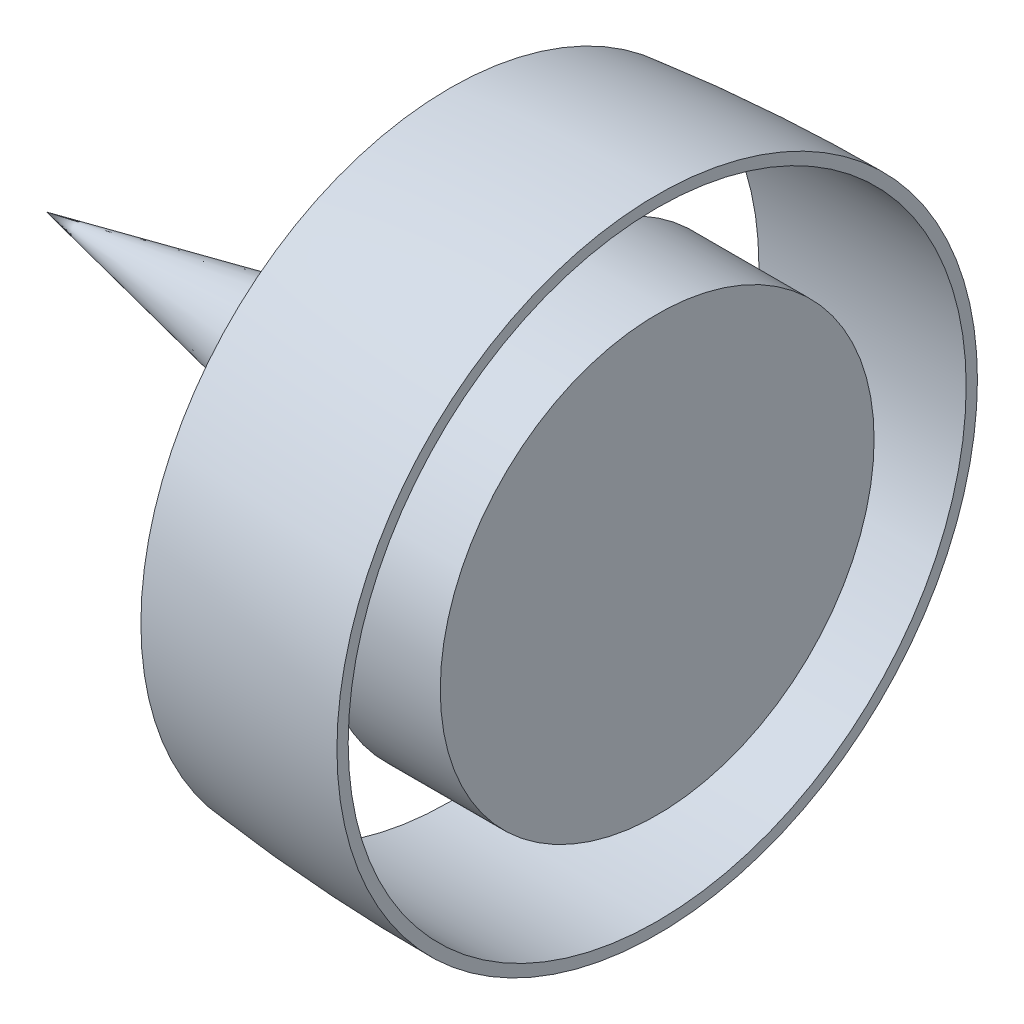
ISO-10303-21;
HEADER;
FILE_DESCRIPTION(('STEP AP214'),'2;1');
FILE_NAME('part.step','',(''),(''),'','','');
FILE_SCHEMA(('AUTOMOTIVE_DESIGN { 1 0 10303 214 1 1 1 1 }'));
ENDSEC;
DATA;
#1=APPLICATION_CONTEXT('core data for automotive mechanical design processes');
#2=APPLICATION_PROTOCOL_DEFINITION('international standard','automotive_design',2000,#1);
#3=PRODUCT_CONTEXT('',#1,'mechanical');
#4=PRODUCT('Part','Part','',(#3));
#5=PRODUCT_RELATED_PRODUCT_CATEGORY('part','',(#4));
#6=PRODUCT_DEFINITION_FORMATION('','',#4);
#7=PRODUCT_DEFINITION_CONTEXT('part definition',#1,'design');
#8=PRODUCT_DEFINITION('design','',#6,#7);
#9=PRODUCT_DEFINITION_SHAPE('','',#8);
#10=(LENGTH_UNIT() NAMED_UNIT(*) SI_UNIT(.MILLI.,.METRE.));
#11=(NAMED_UNIT(*) PLANE_ANGLE_UNIT() SI_UNIT($,.RADIAN.));
#12=(NAMED_UNIT(*) SI_UNIT($,.STERADIAN.) SOLID_ANGLE_UNIT());
#13=UNCERTAINTY_MEASURE_WITH_UNIT(LENGTH_MEASURE(1.E-05),#10,'distance_accuracy_value','');
#14=(GEOMETRIC_REPRESENTATION_CONTEXT(3) GLOBAL_UNCERTAINTY_ASSIGNED_CONTEXT((#13)) GLOBAL_UNIT_ASSIGNED_CONTEXT((#10,
#11,#12)) REPRESENTATION_CONTEXT('',''));
#15=CARTESIAN_POINT('',(0.,0.,0.));
#16=DIRECTION('',(0.,0.,1.));
#17=DIRECTION('',(1.,0.,0.));
#18=AXIS2_PLACEMENT_3D('',#15,#16,#17);
#19=CARTESIAN_POINT('',(1085.87255926414,0.,0.));
#20=DIRECTION('',(-1.,0.,0.));
#21=DIRECTION('',(0.,0.,1.));
#22=AXIS2_PLACEMENT_3D('',#19,#20,#21);
#23=DEGENERATE_TOROIDAL_SURFACE('',#22,2837.28373193807,3406.80408287625,.F.);
#24=CARTESIAN_POINT('',(1085.87255926414,0.,0.));
#25=DIRECTION('',(-1.,0.,0.));
#26=DIRECTION('',(0.,0.,1.));
#27=AXIS2_PLACEMENT_3D('',#24,#25,#26);
#28=CIRCLE('',#27,569.520350938183);
#29=CARTESIAN_POINT('',(1085.87255926414,0.,569.520350938183));
#30=VERTEX_POINT('',#29);
#31=EDGE_CURVE('E59',#30,#30,#28,.T.);
#32=ORIENTED_EDGE('',*,*,#31,.T.);
#33=EDGE_LOOP('',(#32));
#34=FACE_BOUND('',#33,.T.);
#35=CARTESIAN_POINT('',(717.264144662618,0.,0.));
#36=DIRECTION('',(-1.,0.,0.));
#37=DIRECTION('',(0.,0.,1.));
#38=AXIS2_PLACEMENT_3D('',#35,#36,#37);
#39=CIRCLE('',#38,549.520350938183);
#40=CARTESIAN_POINT('',(717.264144662618,0.,549.520350938183));
#41=VERTEX_POINT('',#40);
#42=EDGE_CURVE('E11',#41,#41,#39,.T.);
#43=ORIENTED_EDGE('',*,*,#42,.F.);
#44=EDGE_LOOP('',(#43));
#45=FACE_BOUND('',#44,.T.);
#46=ADVANCED_FACE('F49',(#34,#45),#23,.F.);
#47=CARTESIAN_POINT('',(-275.018458384924,0.,0.));
#48=DIRECTION('',(-1.,0.,0.));
#49=DIRECTION('',(0.,0.,1.));
#50=AXIS2_PLACEMENT_3D('',#47,#48,#49);
#51=CYLINDRICAL_SURFACE('',#50,549.520350938183);
#52=CARTESIAN_POINT('',(1085.87255926414,0.,0.));
#53=DIRECTION('',(-1.,0.,0.));
#54=DIRECTION('',(0.,0.,1.));
#55=AXIS2_PLACEMENT_3D('',#52,#53,#54);
#56=CIRCLE('',#55,549.520350938183);
#57=CARTESIAN_POINT('',(1085.87255926414,0.,549.520350938183));
#58=VERTEX_POINT('',#57);
#59=EDGE_CURVE('E55',#58,#58,#56,.T.);
#60=ORIENTED_EDGE('',*,*,#59,.F.);
#61=EDGE_LOOP('',(#60));
#62=FACE_BOUND('',#61,.T.);
#63=ORIENTED_EDGE('',*,*,#42,.T.);
#64=EDGE_LOOP('',(#63));
#65=FACE_BOUND('',#64,.T.);
#66=ADVANCED_FACE('F70',(#62,#65),#51,.F.);
#67=CARTESIAN_POINT('',(1085.87255926414,-2.41112143420734E-11,0.));
#68=DIRECTION('',(1.,0.,0.));
#69=DIRECTION('',(0.,0.,-1.));
#70=AXIS2_PLACEMENT_3D('',#67,#68,#69);
#71=PLANE('',#70);
#72=ORIENTED_EDGE('',*,*,#59,.T.);
#73=EDGE_LOOP('',(#72));
#74=FACE_BOUND('',#73,.T.);
#75=ORIENTED_EDGE('',*,*,#31,.F.);
#76=EDGE_LOOP('',(#75));
#77=FACE_BOUND('',#76,.T.);
#78=ADVANCED_FACE('F68',(#74,#77),#71,.T.);
#79=CLOSED_SHELL('',(#46,#66,#78));
#80=MANIFOLD_SOLID_BREP('B2',#79);
#81=CARTESIAN_POINT('',(1085.87255926414,0.,0.));
#82=DIRECTION('',(1.,0.,0.));
#83=DIRECTION('',(0.,0.,-1.));
#84=AXIS2_PLACEMENT_3D('',#81,#82,#83);
#85=PLANE('',#84);
#86=CARTESIAN_POINT('',(1085.87255926414,0.,0.));
#87=DIRECTION('',(-1.,0.,0.));
#88=DIRECTION('',(0.,0.,1.));
#89=AXIS2_PLACEMENT_3D('',#86,#87,#88);
#90=CIRCLE('',#89,385.761420337706);
#91=CARTESIAN_POINT('',(1085.87255926414,0.,385.761420337706));
#92=VERTEX_POINT('',#91);
#93=EDGE_CURVE('E47',#92,#92,#90,.T.);
#94=ORIENTED_EDGE('',*,*,#93,.F.);
#95=EDGE_LOOP('',(#94));
#96=FACE_BOUND('',#95,.T.);
#97=ADVANCED_FACE('F96',(#96),#85,.T.);
#98=CARTESIAN_POINT('',(-275.018458384924,0.,0.));
#99=DIRECTION('',(-1.,0.,0.));
#100=DIRECTION('',(0.,0.,1.));
#101=AXIS2_PLACEMENT_3D('',#98,#99,#100);
#102=CYLINDRICAL_SURFACE('',#101,385.761420337706);
#103=ORIENTED_EDGE('',*,*,#93,.T.);
#104=EDGE_LOOP('',(#103));
#105=FACE_BOUND('',#104,.T.);
#106=CARTESIAN_POINT('',(874.852884773034,0.,0.));
#107=DIRECTION('',(-1.,0.,0.));
#108=DIRECTION('',(0.,0.,1.));
#109=AXIS2_PLACEMENT_3D('',#106,#107,#108);
#110=CIRCLE('',#109,385.761420337706);
#111=CARTESIAN_POINT('',(874.852884773034,0.,385.761420337706));
#112=VERTEX_POINT('',#111);
#113=EDGE_CURVE('E102',#112,#112,#110,.T.);
#114=ORIENTED_EDGE('',*,*,#113,.F.);
#115=EDGE_LOOP('',(#114));
#116=FACE_BOUND('',#115,.T.);
#117=ADVANCED_FACE('F118',(#105,#116),#102,.T.);
#118=CARTESIAN_POINT('',(706.922290359307,0.,0.));
#119=DIRECTION('',(1.,0.,0.));
#120=DIRECTION('',(0.,0.,-1.));
#121=AXIS2_PLACEMENT_3D('',#118,#119,#120);
#122=CONICAL_SURFACE('',#121,224.158198439435,0.766199541625512);
#123=ORIENTED_EDGE('',*,*,#113,.T.);
#124=EDGE_LOOP('',(#123));
#125=FACE_BOUND('',#124,.T.);
#126=CARTESIAN_POINT('',(706.922290359307,0.,0.));
#127=DIRECTION('',(-1.,0.,0.));
#128=DIRECTION('',(0.,0.,1.));
#129=AXIS2_PLACEMENT_3D('',#126,#127,#128);
#130=CIRCLE('',#129,224.158198439435);
#131=CARTESIAN_POINT('',(706.922290359307,0.,224.158198439435));
#132=VERTEX_POINT('',#131);
#133=EDGE_CURVE('E129',#132,#132,#130,.T.);
#134=ORIENTED_EDGE('',*,*,#133,.F.);
#135=EDGE_LOOP('',(#134));
#136=FACE_BOUND('',#135,.T.);
#137=ADVANCED_FACE('F113',(#125,#136),#122,.T.);
#138=CARTESIAN_POINT('',(436.83786262326,0.,0.));
#139=DIRECTION('',(1.,0.,0.));
#140=DIRECTION('',(0.,0.,-1.));
#141=AXIS2_PLACEMENT_3D('',#138,#139,#140);
#142=CONICAL_SURFACE('',#141,91.260184195606,0.457276264022515);
#143=ORIENTED_EDGE('',*,*,#133,.T.);
#144=EDGE_LOOP('',(#143));
#145=FACE_BOUND('',#144,.T.);
#146=CARTESIAN_POINT('',(436.83786262326,0.,0.));
#147=DIRECTION('',(-1.,0.,0.));
#148=DIRECTION('',(0.,0.,1.));
#149=AXIS2_PLACEMENT_3D('',#146,#147,#148);
#150=CIRCLE('',#149,91.260184195606);
#151=CARTESIAN_POINT('',(436.83786262326,0.,91.260184195606));
#152=VERTEX_POINT('',#151);
#153=EDGE_CURVE('E131',#152,#152,#150,.T.);
#154=ORIENTED_EDGE('',*,*,#153,.F.);
#155=EDGE_LOOP('',(#154));
#156=FACE_BOUND('',#155,.T.);
#157=ADVANCED_FACE('F107',(#145,#156),#142,.T.);
#158=CARTESIAN_POINT('',(0.,0.,0.));
#159=DIRECTION('',(1.,0.,0.));
#160=DIRECTION('',(0.,0.,-1.));
#161=AXIS2_PLACEMENT_3D('',#158,#159,#160);
#162=CONICAL_SURFACE('',#161,0.,0.205948851735331);
#163=ORIENTED_EDGE('',*,*,#153,.T.);
#164=EDGE_LOOP('',(#163));
#165=FACE_BOUND('',#164,.T.);
#166=CARTESIAN_POINT('',(0.,0.,0.));
#167=VERTEX_POINT('',#166);
#168=VERTEX_LOOP('',#167);
#169=FACE_BOUND('',#168,.T.);
#170=ADVANCED_FACE('F105',(#165,#169),#162,.T.);
#171=CLOSED_SHELL('',(#97,#117,#137,#157,#170));
#172=MANIFOLD_SOLID_BREP('B6',#171);
#173=ADVANCED_BREP_SHAPE_REPRESENTATION('',(#18,#80,#172),#14);
#174=SHAPE_DEFINITION_REPRESENTATION(#9,#173);
ENDSEC;
END-ISO-10303-21;
